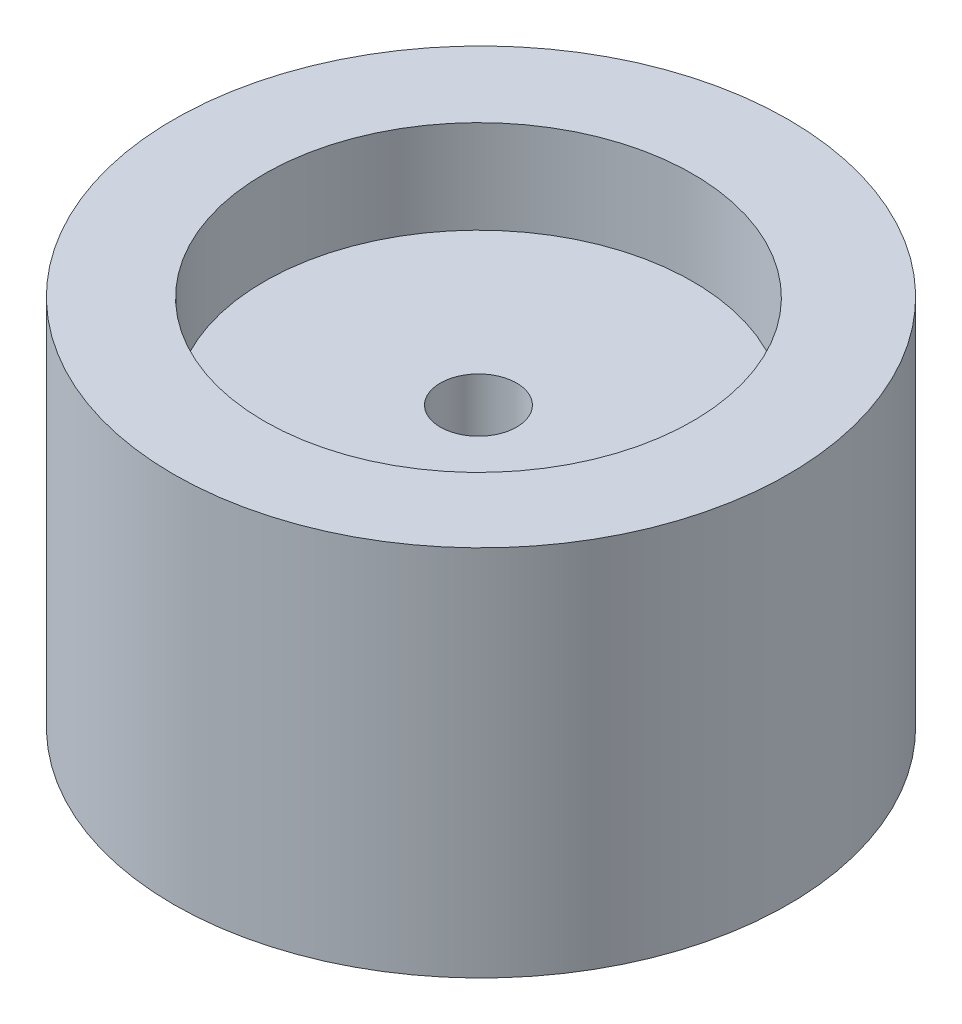
ISO-10303-21;
HEADER;
FILE_DESCRIPTION(('STEP AP214'),'2;1');
FILE_NAME('part.step','',(''),(''),'','','');
FILE_SCHEMA(('AUTOMOTIVE_DESIGN { 1 0 10303 214 1 1 1 1 }'));
ENDSEC;
DATA;
#1=APPLICATION_CONTEXT('core data for automotive mechanical design processes');
#2=APPLICATION_PROTOCOL_DEFINITION('international standard','automotive_design',2000,#1);
#3=PRODUCT_CONTEXT('',#1,'mechanical');
#4=PRODUCT('Part','Part','',(#3));
#5=PRODUCT_RELATED_PRODUCT_CATEGORY('part','',(#4));
#6=PRODUCT_DEFINITION_FORMATION('','',#4);
#7=PRODUCT_DEFINITION_CONTEXT('part definition',#1,'design');
#8=PRODUCT_DEFINITION('design','',#6,#7);
#9=PRODUCT_DEFINITION_SHAPE('','',#8);
#10=(LENGTH_UNIT() NAMED_UNIT(*) SI_UNIT(.MILLI.,.METRE.));
#11=(NAMED_UNIT(*) PLANE_ANGLE_UNIT() SI_UNIT($,.RADIAN.));
#12=(NAMED_UNIT(*) SI_UNIT($,.STERADIAN.) SOLID_ANGLE_UNIT());
#13=UNCERTAINTY_MEASURE_WITH_UNIT(LENGTH_MEASURE(1.E-05),#10,'distance_accuracy_value','');
#14=(GEOMETRIC_REPRESENTATION_CONTEXT(3) GLOBAL_UNCERTAINTY_ASSIGNED_CONTEXT((#13)) GLOBAL_UNIT_ASSIGNED_CONTEXT((#10,
#11,#12)) REPRESENTATION_CONTEXT('',''));
#15=CARTESIAN_POINT('',(0.,0.,0.));
#16=DIRECTION('',(0.,0.,1.));
#17=DIRECTION('',(1.,0.,0.));
#18=AXIS2_PLACEMENT_3D('',#15,#16,#17);
#19=CARTESIAN_POINT('',(-11.112077011578,0.,-20.9007097057315));
#20=DIRECTION('',(0.,1.,0.));
#21=DIRECTION('',(0.,0.,1.));
#22=AXIS2_PLACEMENT_3D('',#19,#20,#21);
#23=CYLINDRICAL_SURFACE('',#22,2.05);
#24=CARTESIAN_POINT('',(-11.112077011578,0.,-20.9007097057315));
#25=DIRECTION('',(0.,1.,0.));
#26=DIRECTION('',(0.,0.,1.));
#27=AXIS2_PLACEMENT_3D('',#24,#25,#26);
#28=CIRCLE('',#27,2.05);
#29=CARTESIAN_POINT('',(-11.112077011578,0.,-18.8507097057315));
#30=VERTEX_POINT('',#29);
#31=EDGE_CURVE('E48',#30,#30,#28,.T.);
#32=ORIENTED_EDGE('',*,*,#31,.F.);
#33=EDGE_LOOP('',(#32));
#34=FACE_BOUND('',#33,.T.);
#35=CARTESIAN_POINT('',(-11.112077011578,15.,-20.9007097057315));
#36=DIRECTION('',(0.,1.,0.));
#37=DIRECTION('',(0.,0.,1.));
#38=AXIS2_PLACEMENT_3D('',#35,#36,#37);
#39=CIRCLE('',#38,2.05);
#40=CARTESIAN_POINT('',(-11.112077011578,15.,-18.8507097057315));
#41=VERTEX_POINT('',#40);
#42=EDGE_CURVE('E39',#41,#41,#39,.F.);
#43=ORIENTED_EDGE('',*,*,#42,.F.);
#44=EDGE_LOOP('',(#43));
#45=FACE_BOUND('',#44,.T.);
#46=ADVANCED_FACE('F35',(#34,#45),#23,.F.);
#47=CARTESIAN_POINT('',(-11.0733382765573,20.,-20.9975565432832));
#48=DIRECTION('',(0.,-1.,0.));
#49=DIRECTION('',(0.,0.,-1.));
#50=AXIS2_PLACEMENT_3D('',#47,#48,#49);
#51=CYLINDRICAL_SURFACE('',#50,16.5);
#52=CARTESIAN_POINT('',(-11.0733382765573,20.,-20.9975565432832));
#53=DIRECTION('',(0.,1.,0.));
#54=DIRECTION('',(0.,0.,1.));
#55=AXIS2_PLACEMENT_3D('',#52,#53,#54);
#56=CIRCLE('',#55,16.5);
#57=CARTESIAN_POINT('',(-11.0733382765573,20.,-4.49755654328324));
#58=VERTEX_POINT('',#57);
#59=EDGE_CURVE('E10',#58,#58,#56,.T.);
#60=ORIENTED_EDGE('',*,*,#59,.F.);
#61=EDGE_LOOP('',(#60));
#62=FACE_BOUND('',#61,.T.);
#63=CARTESIAN_POINT('',(-11.0733382765573,0.,-20.9975565432832));
#64=DIRECTION('',(0.,1.,0.));
#65=DIRECTION('',(0.,0.,1.));
#66=AXIS2_PLACEMENT_3D('',#63,#64,#65);
#67=CIRCLE('',#66,16.5);
#68=CARTESIAN_POINT('',(-11.0733382765573,0.,-4.49755654328324));
#69=VERTEX_POINT('',#68);
#70=EDGE_CURVE('E43',#69,#69,#67,.T.);
#71=ORIENTED_EDGE('',*,*,#70,.T.);
#72=EDGE_LOOP('',(#71));
#73=FACE_BOUND('',#72,.T.);
#74=ADVANCED_FACE('F37',(#62,#73),#51,.T.);
#75=CARTESIAN_POINT('',(-11.0733382765573,20.,-20.9975565432832));
#76=DIRECTION('',(0.,1.,0.));
#77=DIRECTION('',(0.,0.,1.));
#78=AXIS2_PLACEMENT_3D('',#75,#76,#77);
#79=PLANE('',#78);
#80=CARTESIAN_POINT('',(-11.112077011578,20.,-20.9007097057315));
#81=DIRECTION('',(0.,1.,0.));
#82=DIRECTION('',(0.,0.,1.));
#83=AXIS2_PLACEMENT_3D('',#80,#81,#82);
#84=CIRCLE('',#83,11.5);
#85=CARTESIAN_POINT('',(-11.112077011578,20.,-9.4007097057315));
#86=VERTEX_POINT('',#85);
#87=EDGE_CURVE('E52',#86,#86,#84,.T.);
#88=ORIENTED_EDGE('',*,*,#87,.F.);
#89=EDGE_LOOP('',(#88));
#90=FACE_BOUND('',#89,.T.);
#91=ORIENTED_EDGE('',*,*,#59,.T.);
#92=EDGE_LOOP('',(#91));
#93=FACE_BOUND('',#92,.T.);
#94=ADVANCED_FACE('F70',(#90,#93),#79,.T.);
#95=CARTESIAN_POINT('',(-11.0733382765573,0.,-20.9975565432832));
#96=DIRECTION('',(0.,1.,0.));
#97=DIRECTION('',(0.,0.,1.));
#98=AXIS2_PLACEMENT_3D('',#95,#96,#97);
#99=PLANE('',#98);
#100=ORIENTED_EDGE('',*,*,#31,.T.);
#101=EDGE_LOOP('',(#100));
#102=FACE_BOUND('',#101,.T.);
#103=ORIENTED_EDGE('',*,*,#70,.F.);
#104=EDGE_LOOP('',(#103));
#105=FACE_BOUND('',#104,.T.);
#106=ADVANCED_FACE('F78',(#102,#105),#99,.F.);
#107=CARTESIAN_POINT('',(-11.112077011578,15.,-20.9007097057315));
#108=DIRECTION('',(0.,1.,0.));
#109=DIRECTION('',(0.,0.,1.));
#110=AXIS2_PLACEMENT_3D('',#107,#108,#109);
#111=PLANE('',#110);
#112=CARTESIAN_POINT('',(-11.112077011578,15.,-20.9007097057315));
#113=DIRECTION('',(0.,1.,0.));
#114=DIRECTION('',(0.,0.,1.));
#115=AXIS2_PLACEMENT_3D('',#112,#113,#114);
#116=CIRCLE('',#115,11.5);
#117=CARTESIAN_POINT('',(-11.112077011578,15.,-9.4007097057315));
#118=VERTEX_POINT('',#117);
#119=EDGE_CURVE('E55',#118,#118,#116,.T.);
#120=ORIENTED_EDGE('',*,*,#119,.T.);
#121=EDGE_LOOP('',(#120));
#122=FACE_BOUND('',#121,.T.);
#123=ORIENTED_EDGE('',*,*,#42,.T.);
#124=EDGE_LOOP('',(#123));
#125=FACE_BOUND('',#124,.T.);
#126=ADVANCED_FACE('F62',(#122,#125),#111,.T.);
#127=CARTESIAN_POINT('',(-11.112077011578,15.,-20.9007097057315));
#128=DIRECTION('',(0.,1.,0.));
#129=DIRECTION('',(0.,0.,1.));
#130=AXIS2_PLACEMENT_3D('',#127,#128,#129);
#131=CYLINDRICAL_SURFACE('',#130,11.5);
#132=ORIENTED_EDGE('',*,*,#119,.F.);
#133=EDGE_LOOP('',(#132));
#134=FACE_BOUND('',#133,.T.);
#135=ORIENTED_EDGE('',*,*,#87,.T.);
#136=EDGE_LOOP('',(#135));
#137=FACE_BOUND('',#136,.T.);
#138=ADVANCED_FACE('F75',(#134,#137),#131,.F.);
#139=CLOSED_SHELL('',(#46,#74,#94,#106,#126,#138));
#140=MANIFOLD_SOLID_BREP('B2',#139);
#141=ADVANCED_BREP_SHAPE_REPRESENTATION('',(#18,#140),#14);
#142=SHAPE_DEFINITION_REPRESENTATION(#9,#141);
ENDSEC;
END-ISO-10303-21;
